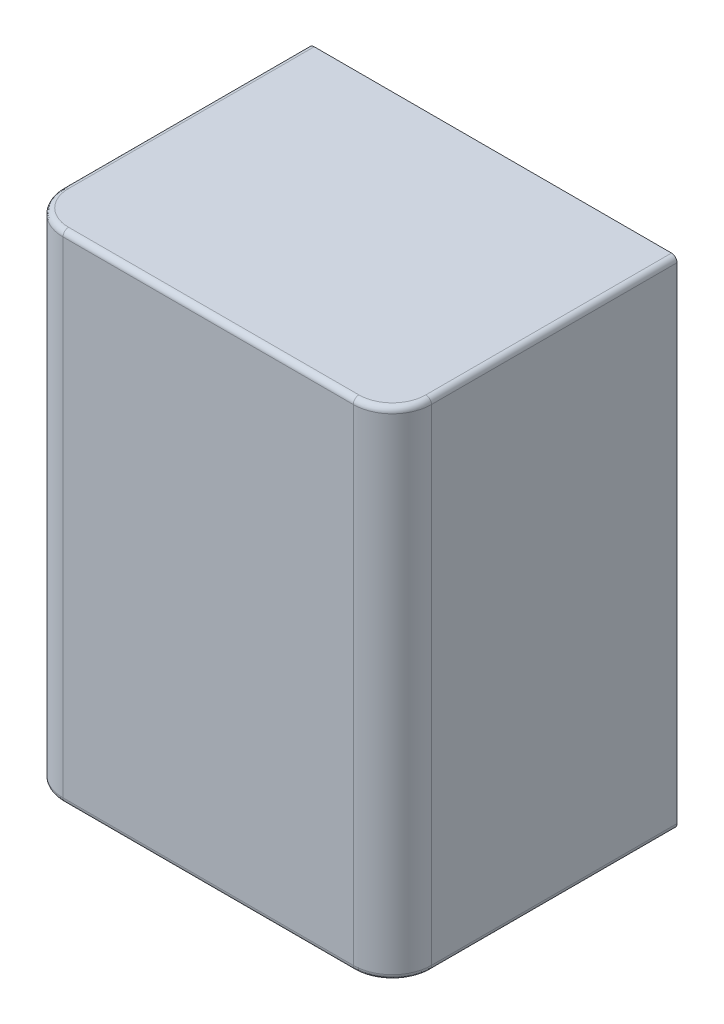
ISO-10303-21;
HEADER;
FILE_DESCRIPTION(('STEP AP214'),'2;1');
FILE_NAME('part.step','',(''),(''),'','','');
FILE_SCHEMA(('AUTOMOTIVE_DESIGN { 1 0 10303 214 1 1 1 1 }'));
ENDSEC;
DATA;
#1=APPLICATION_CONTEXT('core data for automotive mechanical design processes');
#2=APPLICATION_PROTOCOL_DEFINITION('international standard','automotive_design',2000,#1);
#3=PRODUCT_CONTEXT('',#1,'mechanical');
#4=PRODUCT('Part','Part','',(#3));
#5=PRODUCT_RELATED_PRODUCT_CATEGORY('part','',(#4));
#6=PRODUCT_DEFINITION_FORMATION('','',#4);
#7=PRODUCT_DEFINITION_CONTEXT('part definition',#1,'design');
#8=PRODUCT_DEFINITION('design','',#6,#7);
#9=PRODUCT_DEFINITION_SHAPE('','',#8);
#10=(LENGTH_UNIT() NAMED_UNIT(*) SI_UNIT(.MILLI.,.METRE.));
#11=(NAMED_UNIT(*) PLANE_ANGLE_UNIT() SI_UNIT($,.RADIAN.));
#12=(NAMED_UNIT(*) SI_UNIT($,.STERADIAN.) SOLID_ANGLE_UNIT());
#13=UNCERTAINTY_MEASURE_WITH_UNIT(LENGTH_MEASURE(1.E-05),#10,'distance_accuracy_value','');
#14=(GEOMETRIC_REPRESENTATION_CONTEXT(3) GLOBAL_UNCERTAINTY_ASSIGNED_CONTEXT((#13)) GLOBAL_UNIT_ASSIGNED_CONTEXT((#10,
#11,#12)) REPRESENTATION_CONTEXT('',''));
#15=CARTESIAN_POINT('',(0.,0.,0.));
#16=DIRECTION('',(0.,0.,1.));
#17=DIRECTION('',(1.,0.,0.));
#18=AXIS2_PLACEMENT_3D('',#15,#16,#17);
#19=CARTESIAN_POINT('',(55.330001258903,71.945000573336,-1.666522054294));
#20=DIRECTION('',(0.,4.371138828674E-08,-0.999999999999999));
#21=DIRECTION('',(0.,0.999999999999999,4.371138828674E-08));
#22=AXIS2_PLACEMENT_3D('',#19,#20,#21);
#23=PLANE('',#22);
#24=DIRECTION('',(0.999999999999996,-8.74227765734797E-08,0.));
#25=VECTOR('',#24,1.);
#26=CARTESIAN_POINT('',(55.330001181971,71.0650005733364,-1.66652209276));
#27=LINE('',#26,#25);
#28=CARTESIAN_POINT('',(55.2600011819712,71.065000579456,-1.66652209276));
#29=VERTEX_POINT('',#28);
#30=CARTESIAN_POINT('',(54.740001181971,71.0650006249151,-1.66652209276012));
#31=VERTEX_POINT('',#30);
#32=EDGE_CURVE('E140',#29,#31,#27,.F.);
#33=ORIENTED_EDGE('',*,*,#32,.F.);
#34=DIRECTION('',(8.74227765734796E-08,0.999999999999995,4.37113882867398E-08));
#35=VECTOR('',#34,1.);
#36=CARTESIAN_POINT('',(55.2600012589032,71.9450005794552,-1.666522054294));
#37=LINE('',#36,#35);
#38=CARTESIAN_POINT('',(55.260001258029,71.9350005794555,-1.66652205473106));
#39=VERTEX_POINT('',#38);
#40=EDGE_CURVE('E112',#39,#29,#37,.F.);
#41=ORIENTED_EDGE('',*,*,#40,.F.);
#42=DIRECTION('',(-0.999999999999996,8.74227765734797E-08,0.));
#43=VECTOR('',#42,1.);
#44=CARTESIAN_POINT('',(55.330001258029,71.9350005733356,-1.666522054731));
#45=LINE('',#44,#43);
#46=CARTESIAN_POINT('',(54.7400012580289,71.935000624915,-1.66652205473094));
#47=VERTEX_POINT('',#46);
#48=EDGE_CURVE('E108',#47,#39,#45,.F.);
#49=ORIENTED_EDGE('',*,*,#48,.F.);
#50=DIRECTION('',(8.74227765734796E-08,0.999999999999995,4.37113882867398E-08));
#51=VECTOR('',#50,1.);
#52=CARTESIAN_POINT('',(54.740001258903,71.9450006249152,-1.666522054294));
#53=LINE('',#52,#51);
#54=EDGE_CURVE('E110',#31,#47,#53,.T.);
#55=ORIENTED_EDGE('',*,*,#54,.F.);
#56=EDGE_LOOP('',(#33,#41,#49,#55));
#57=FACE_BOUND('',#56,.T.);
#58=ADVANCED_FACE('F17',(#57),#23,.F.);
#59=CARTESIAN_POINT('',(55.330001258029,71.935000576396,-1.736522054731));
#60=CARTESIAN_POINT('',(55.330001258029,71.935000574603,-1.695517004097));
#61=CARTESIAN_POINT('',(55.301006308663,71.935000575871,-1.666522054731));
#62=CARTESIAN_POINT('',(55.260001258029,71.935000579456,-1.666522054731));
#63=CARTESIAN_POINT('',(55.330001258541,71.940858440772,-1.736522054475));
#64=CARTESIAN_POINT('',(55.330001258541,71.940858438979,-1.695517003841));
#65=CARTESIAN_POINT('',(55.301006309175,71.940858440247,-1.666522054475));
#66=CARTESIAN_POINT('',(55.260001258541,71.940858443832,-1.666522054475));
#67=CARTESIAN_POINT('',(55.325859123279,71.945000576758,-1.736522054294));
#68=CARTESIAN_POINT('',(55.325859123279,71.945000575072,-1.697943410531));
#69=CARTESIAN_POINT('',(55.298579902666,71.945000576264,-1.670664189918));
#70=CARTESIAN_POINT('',(55.260001258903,71.945000579637,-1.670664189918));
#71=CARTESIAN_POINT('',(55.320001258903,71.94500057727,-1.736522054294));
#72=CARTESIAN_POINT('',(55.320001258903,71.945000575734,-1.701374868037));
#73=CARTESIAN_POINT('',(55.295148445161,71.94500057682,-1.676522054294));
#74=CARTESIAN_POINT('',(55.260001258903,71.945000579893,-1.676522054294));
#75=(BOUNDED_SURFACE() B_SPLINE_SURFACE(3,3,((#59,#60,#61,#62),(#63,#64,#65,#66),(#67,#68,#69,
#70),(#71,#72,#73,#74)),.UNSPECIFIED.,.F.,.F.,.F.) B_SPLINE_SURFACE_WITH_KNOTS((4,4),(4,4),(0.,
1.),(0.,1.),.UNSPECIFIED.) GEOMETRIC_REPRESENTATION_ITEM() RATIONAL_B_SPLINE_SURFACE(((1.,
0.804737854124,0.804737854124,1.),(0.804737854124,0.647603013861,0.647603013861,0.804737854124),
(0.804737854124,0.647603013861,0.647603013861,0.804737854124),(1.,0.804737854124,0.804737854124,1.))) REPRESENTATION_ITEM('') SURFACE());
#76=CARTESIAN_POINT('',(55.320001258029,71.9350005772702,-1.73652205473111));
#77=DIRECTION('',(0.,-4.371138835999E-08,0.999999999999999));
#78=DIRECTION('',(0.,-0.999999999999999,-4.371138835999E-08));
#79=AXIS2_PLACEMENT_3D('',#76,#77,#78);
#80=CIRCLE('',#79,0.01);
#81=CARTESIAN_POINT('',(55.320001258903,71.9450005772702,-1.736522054294));
#82=VERTEX_POINT('',#81);
#83=CARTESIAN_POINT('',(55.330001258029,71.935000576396,-1.73652208325278));
#84=VERTEX_POINT('',#83);
#85=EDGE_CURVE('E346',#82,#84,#80,.F.);
#86=CARTESIAN_POINT('',(55.320001258903,71.94500057727,-1.736522054294));
#87=CARTESIAN_POINT('',(55.320001258903,71.945000575734,-1.70137486803698));
#88=CARTESIAN_POINT('',(55.295148445161,71.94500057682,-1.67652205429397));
#89=CARTESIAN_POINT('',(55.260001258903,71.945000579893,-1.67652205429397));
#90=(BOUNDED_CURVE() B_SPLINE_CURVE(3,(#86,#87,#88,#89),.UNSPECIFIED.,.F.,
.F.) B_SPLINE_CURVE_WITH_KNOTS((4,4),(0.,1.),
.UNSPECIFIED.) CURVE() GEOMETRIC_REPRESENTATION_ITEM() RATIONAL_B_SPLINE_CURVE((0.999999999998696,
0.804737854122951,0.804737854122951,0.999999999998696)) REPRESENTATION_ITEM(''));
#91=CARTESIAN_POINT('',(55.2600012589031,71.9450005798929,-1.676522054294));
#92=VERTEX_POINT('',#91);
#93=EDGE_CURVE('E302',#92,#82,#90,.F.);
#94=CARTESIAN_POINT('',(55.260001258029,71.9350005798926,-1.676522054731));
#95=DIRECTION('',(-0.999999999999996,8.74227765734797E-08,0.));
#96=DIRECTION('',(-8.74227765734797E-08,-0.999999999999996,0.));
#97=AXIS2_PLACEMENT_3D('',#94,#95,#96);
#98=CIRCLE('',#97,0.01);
#99=EDGE_CURVE('E116',#39,#92,#98,.T.);
#100=CARTESIAN_POINT('',(55.2600012580288,71.9350005825156,-1.73652205473111));
#101=DIRECTION('',(8.74227765734796E-08,0.999999999999995,4.37113882867398E-08));
#102=DIRECTION('',(-0.999999999999996,8.74227765734797E-08,0.));
#103=AXIS2_PLACEMENT_3D('',#100,#101,#102);
#104=CIRCLE('',#103,0.07);
#105=EDGE_CURVE('E201',#84,#39,#104,.F.);
#106=ORIENTED_EDGE('',*,*,#85,.F.);
#107=ORIENTED_EDGE('',*,*,#93,.F.);
#108=ORIENTED_EDGE('',*,*,#99,.F.);
#109=ORIENTED_EDGE('',*,*,#105,.F.);
#110=EDGE_LOOP('',(#106,#107,#108,#109));
#111=FACE_BOUND('',#110,.T.);
#112=ADVANCED_FACE('F178',(#111),#75,.T.);
#113=CARTESIAN_POINT('',(55.330001258029,71.935000573773,-1.676522054731));
#114=DIRECTION('',(-0.999999999999996,8.74227765734797E-08,0.));
#115=DIRECTION('',(-8.74227765734797E-08,-0.999999999999996,0.));
#116=AXIS2_PLACEMENT_3D('',#113,#114,#115);
#117=CYLINDRICAL_SURFACE('',#116,0.01);
#118=ORIENTED_EDGE('',*,*,#48,.T.);
#119=ORIENTED_EDGE('',*,*,#99,.T.);
#120=DIRECTION('',(-0.999999999999996,8.74227765335397E-08,0.));
#121=VECTOR('',#120,1.);
#122=CARTESIAN_POINT('',(55.000001258903,71.9450006026228,-1.676522054294));
#123=LINE('',#122,#121);
#124=CARTESIAN_POINT('',(54.740001258903,71.9450006253527,-1.67652205429397));
#125=VERTEX_POINT('',#124);
#126=EDGE_CURVE('E130',#125,#92,#123,.F.);
#127=ORIENTED_EDGE('',*,*,#126,.F.);
#128=CARTESIAN_POINT('',(54.740001258029,71.935000625352,-1.67652205473103));
#129=DIRECTION('',(-0.999999999999996,8.74038952805653E-08,0.));
#130=DIRECTION('',(1.38777878077792E-12,-4.37025415854775E-08,0.999999999999999));
#131=AXIS2_PLACEMENT_3D('',#128,#129,#130);
#132=CIRCLE('',#131,0.0100000000004965);
#133=EDGE_CURVE('E125',#47,#125,#132,.T.);
#134=ORIENTED_EDGE('',*,*,#133,.F.);
#135=EDGE_LOOP('',(#118,#119,#127,#134));
#136=FACE_BOUND('',#135,.T.);
#137=ADVANCED_FACE('F128',(#136),#117,.T.);
#138=CARTESIAN_POINT('',(54.740001258029,71.935000624915,-1.666522054731));
#139=CARTESIAN_POINT('',(54.698996207395,71.9350006285,-1.666522054731));
#140=CARTESIAN_POINT('',(54.670001258029,71.935000632302,-1.695517004097));
#141=CARTESIAN_POINT('',(54.670001258029,71.935000634095,-1.736522054731));
#142=CARTESIAN_POINT('',(54.740001258541,71.940858489291,-1.666522054475));
#143=CARTESIAN_POINT('',(54.698996207907,71.940858492876,-1.666522054475));
#144=CARTESIAN_POINT('',(54.670001258541,71.940858496678,-1.695517003841));
#145=CARTESIAN_POINT('',(54.670001258541,71.940858498471,-1.736522054475));
#146=CARTESIAN_POINT('',(54.740001258903,71.945000625097,-1.670664189918));
#147=CARTESIAN_POINT('',(54.70142261514,71.945000628469,-1.670664189918));
#148=CARTESIAN_POINT('',(54.674143394527,71.945000632046,-1.697943410531));
#149=CARTESIAN_POINT('',(54.674143394527,71.945000633733,-1.736522054294));
#150=CARTESIAN_POINT('',(54.740001258903,71.945000625353,-1.676522054294));
#151=CARTESIAN_POINT('',(54.704854072645,71.945000628425,-1.676522054294));
#152=CARTESIAN_POINT('',(54.680001258903,71.945000631684,-1.701374868037));
#153=CARTESIAN_POINT('',(54.680001258903,71.945000633221,-1.736522054294));
#154=(BOUNDED_SURFACE() B_SPLINE_SURFACE(3,3,((#138,#139,#140,#141),(#142,#143,#144,#145),(#146,
#147,#148,#149),(#150,#151,#152,#153)),.UNSPECIFIED.,.F.,.F.,
.F.) B_SPLINE_SURFACE_WITH_KNOTS((4,4),(4,4),(0.,1.),(0.,1.),
.UNSPECIFIED.) GEOMETRIC_REPRESENTATION_ITEM() RATIONAL_B_SPLINE_SURFACE(((1.,0.804737854124,
0.804737854124,1.),(0.804737854124,0.647603013861,0.647603013861,0.804737854124),
(0.804737854124,0.647603013861,0.647603013861,0.804737854124),(1.,0.804737854124,0.804737854124,1.))) REPRESENTATION_ITEM('') SURFACE());
#155=CARTESIAN_POINT('',(54.740001258903,71.945000625353,-1.67652205429397));
#156=CARTESIAN_POINT('',(54.704854072645,71.945000628425,-1.67652205429397));
#157=CARTESIAN_POINT('',(54.680001258903,71.945000631684,-1.70137486803698));
#158=CARTESIAN_POINT('',(54.680001258903,71.945000633221,-1.736522054294));
#159=(BOUNDED_CURVE() B_SPLINE_CURVE(3,(#155,#156,#157,#158),.UNSPECIFIED.,.F.,
.F.) B_SPLINE_CURVE_WITH_KNOTS((4,4),(0.,1.),
.UNSPECIFIED.) CURVE() GEOMETRIC_REPRESENTATION_ITEM() RATIONAL_B_SPLINE_CURVE((0.99999999999862,
0.80473785412289,0.80473785412289,0.99999999999862)) REPRESENTATION_ITEM(''));
#160=CARTESIAN_POINT('',(54.680001258903,71.9450006332206,-1.73652205429394));
#161=VERTEX_POINT('',#160);
#162=EDGE_CURVE('E154',#161,#125,#159,.F.);
#163=CARTESIAN_POINT('',(54.680001258029,71.9350006332202,-1.736522054731));
#164=DIRECTION('',(0.,-4.371138835999E-08,0.999999999999999));
#165=DIRECTION('',(0.,-0.999999999999999,-4.371138835999E-08));
#166=AXIS2_PLACEMENT_3D('',#163,#164,#165);
#167=CIRCLE('',#166,0.01);
#168=CARTESIAN_POINT('',(54.6700012580288,71.9350006340949,-1.73652207374553));
#169=VERTEX_POINT('',#168);
#170=EDGE_CURVE('E138',#169,#161,#167,.F.);
#171=CARTESIAN_POINT('',(54.7400012580288,71.9350006279748,-1.73652205473111));
#172=DIRECTION('',(8.74227765734796E-08,0.999999999999995,4.37113882867398E-08));
#173=DIRECTION('',(-0.999999999999996,8.74227765734797E-08,0.));
#174=AXIS2_PLACEMENT_3D('',#171,#172,#173);
#175=CIRCLE('',#174,0.07);
#176=EDGE_CURVE('E122',#47,#169,#175,.F.);
#177=ORIENTED_EDGE('',*,*,#162,.F.);
#178=ORIENTED_EDGE('',*,*,#170,.F.);
#179=ORIENTED_EDGE('',*,*,#176,.F.);
#180=ORIENTED_EDGE('',*,*,#133,.T.);
#181=EDGE_LOOP('',(#177,#178,#179,#180));
#182=FACE_BOUND('',#181,.T.);
#183=ADVANCED_FACE('F136',(#182),#154,.T.);
#184=CARTESIAN_POINT('',(54.740001258903,71.945000627975,-1.736522054294));
#185=DIRECTION('',(8.74227765734796E-08,0.999999999999995,4.37113882867398E-08));
#186=DIRECTION('',(-0.999999999999996,8.74227765734797E-08,0.));
#187=AXIS2_PLACEMENT_3D('',#184,#185,#186);
#188=CYLINDRICAL_SURFACE('',#187,0.07);
#189=ORIENTED_EDGE('',*,*,#176,.T.);
#190=DIRECTION('',(-8.74227765734797E-08,-0.999999999999996,0.));
#191=VECTOR('',#190,1.);
#192=CARTESIAN_POINT('',(54.670001258903,71.945000633221,-1.73652209276));
#193=LINE('',#192,#191);
#194=CARTESIAN_POINT('',(54.670001181971,71.0650006340951,-1.73652209275994));
#195=VERTEX_POINT('',#194);
#196=EDGE_CURVE('E293',#195,#169,#193,.F.);
#197=ORIENTED_EDGE('',*,*,#196,.F.);
#198=CARTESIAN_POINT('',(54.740001181971,71.0650006279754,-1.73652209276001));
#199=DIRECTION('',(-8.74284322442814E-08,-0.999999999999995,-4.37262307754475E-08));
#200=DIRECTION('',(-0.999999999999996,8.7422727787103E-08,1.73472347597679E-13));
#201=AXIS2_PLACEMENT_3D('',#198,#199,#200);
#202=CIRCLE('',#201,0.0700000000000066);
#203=EDGE_CURVE('E124',#31,#195,#202,.T.);
#204=ORIENTED_EDGE('',*,*,#203,.F.);
#205=ORIENTED_EDGE('',*,*,#54,.T.);
#206=EDGE_LOOP('',(#189,#197,#204,#205));
#207=FACE_BOUND('',#206,.T.);
#208=ADVANCED_FACE('F119',(#207),#188,.T.);
#209=CARTESIAN_POINT('',(55.330001181971,71.065000573773,-1.67652209276));
#210=DIRECTION('',(0.999999999999996,-8.74227765734797E-08,0.));
#211=DIRECTION('',(8.74227765734797E-08,0.999999999999996,0.));
#212=AXIS2_PLACEMENT_3D('',#209,#210,#211);
#213=CYLINDRICAL_SURFACE('',#212,0.01);
#214=ORIENTED_EDGE('',*,*,#32,.T.);
#215=CARTESIAN_POINT('',(54.740001181971,71.065000625352,-1.67652209275997));
#216=DIRECTION('',(-0.999999999999996,8.74038952807724E-08,0.));
#217=DIRECTION('',(-1.38777878078496E-12,-4.37025415856992E-08,0.999999999999999));
#218=AXIS2_PLACEMENT_3D('',#215,#216,#217);
#219=CIRCLE('',#218,0.0099999999994997);
#220=CARTESIAN_POINT('',(54.740001181097,71.0550006253527,-1.67652209319703));
#221=VERTEX_POINT('',#220);
#222=EDGE_CURVE('E142',#221,#31,#219,.T.);
#223=ORIENTED_EDGE('',*,*,#222,.F.);
#224=DIRECTION('',(0.999999999999996,-8.74227765639397E-08,0.));
#225=VECTOR('',#224,1.);
#226=CARTESIAN_POINT('',(55.000001181097,71.0550006026228,-1.676522093197));
#227=LINE('',#226,#225);
#228=CARTESIAN_POINT('',(55.260001181097,71.055000579893,-1.676522093197));
#229=VERTEX_POINT('',#228);
#230=EDGE_CURVE('E282',#229,#221,#227,.F.);
#231=ORIENTED_EDGE('',*,*,#230,.F.);
#232=CARTESIAN_POINT('',(55.260001181971,71.065000579893,-1.67652209275997));
#233=DIRECTION('',(0.999999999999996,-8.74027107372815E-08,0.));
#234=DIRECTION('',(-1.38777878078496E-12,-4.37025415856992E-08,0.999999999999999));
#235=AXIS2_PLACEMENT_3D('',#232,#233,#234);
#236=CIRCLE('',#235,0.0099999999999993);
#237=EDGE_CURVE('E353',#29,#229,#236,.T.);
#238=ORIENTED_EDGE('',*,*,#237,.F.);
#239=EDGE_LOOP('',(#214,#223,#231,#238));
#240=FACE_BOUND('',#239,.T.);
#241=ADVANCED_FACE('F382',(#240),#213,.T.);
#242=CARTESIAN_POINT('',(54.670001181971,71.065000634095,-1.73652209276));
#243=CARTESIAN_POINT('',(54.670001181971,71.065000632302,-1.695517042126));
#244=CARTESIAN_POINT('',(54.698996131337,71.0650006285,-1.66652209276));
#245=CARTESIAN_POINT('',(54.740001181971,71.065000624915,-1.66652209276));
#246=CARTESIAN_POINT('',(54.670001181459,71.059142769719,-1.736522093016));
#247=CARTESIAN_POINT('',(54.670001181459,71.059142767926,-1.695517042382));
#248=CARTESIAN_POINT('',(54.698996130825,71.059142764124,-1.666522093016));
#249=CARTESIAN_POINT('',(54.740001181459,71.059142760539,-1.666522093016));
#250=CARTESIAN_POINT('',(54.674143316721,71.055000633733,-1.736522093197));
#251=CARTESIAN_POINT('',(54.674143316721,71.055000632046,-1.697943449435));
#252=CARTESIAN_POINT('',(54.701422537334,71.055000628469,-1.670664228821));
#253=CARTESIAN_POINT('',(54.740001181097,71.055000625097,-1.670664228821));
#254=CARTESIAN_POINT('',(54.680001181097,71.055000633221,-1.736522093197));
#255=CARTESIAN_POINT('',(54.680001181097,71.055000631684,-1.70137490694));
#256=CARTESIAN_POINT('',(54.704853994839,71.055000628425,-1.676522093197));
#257=CARTESIAN_POINT('',(54.740001181097,71.055000625353,-1.676522093197));
#258=(BOUNDED_SURFACE() B_SPLINE_SURFACE(3,3,((#242,#243,#244,#245),(#246,#247,#248,#249),(#250,
#251,#252,#253),(#254,#255,#256,#257)),.UNSPECIFIED.,.F.,.F.,
.F.) B_SPLINE_SURFACE_WITH_KNOTS((4,4),(4,4),(0.,1.),(0.,1.),
.UNSPECIFIED.) GEOMETRIC_REPRESENTATION_ITEM() RATIONAL_B_SPLINE_SURFACE(((1.,0.804737854124,
0.804737854124,1.),(0.804737854124,0.647603013861,0.647603013861,0.804737854124),
(0.804737854124,0.647603013861,0.647603013861,0.804737854124),(1.,0.804737854124,0.804737854124,1.))) REPRESENTATION_ITEM('') SURFACE());
#259=CARTESIAN_POINT('',(54.680001181971,71.0650006332202,-1.73652209275989));
#260=DIRECTION('',(0.,4.371138821348E-08,-0.999999999999999));
#261=DIRECTION('',(0.,0.999999999999999,4.371138821348E-08));
#262=AXIS2_PLACEMENT_3D('',#259,#260,#261);
#263=CIRCLE('',#262,0.01);
#264=CARTESIAN_POINT('',(54.680001181097,71.0550006332207,-1.736522093197));
#265=VERTEX_POINT('',#264);
#266=EDGE_CURVE('E288',#265,#195,#263,.T.);
#267=CARTESIAN_POINT('',(54.680001181097,71.055000633221,-1.736522093197));
#268=CARTESIAN_POINT('',(54.680001181097,71.055000631684,-1.70137490693998));
#269=CARTESIAN_POINT('',(54.704853994839,71.055000628425,-1.67652209319697));
#270=CARTESIAN_POINT('',(54.740001181097,71.055000625353,-1.67652209319697));
#271=(BOUNDED_CURVE() B_SPLINE_CURVE(3,(#267,#268,#269,#270),.UNSPECIFIED.,.F.,
.F.) B_SPLINE_CURVE_WITH_KNOTS((4,4),(0.,1.),
.UNSPECIFIED.) CURVE() GEOMETRIC_REPRESENTATION_ITEM() RATIONAL_B_SPLINE_CURVE((0.999999999998653,
0.804737854122916,0.804737854122916,0.999999999998653)) REPRESENTATION_ITEM(''));
#272=EDGE_CURVE('E279',#221,#265,#271,.F.);
#273=ORIENTED_EDGE('',*,*,#222,.T.);
#274=ORIENTED_EDGE('',*,*,#203,.T.);
#275=ORIENTED_EDGE('',*,*,#266,.F.);
#276=ORIENTED_EDGE('',*,*,#272,.F.);
#277=EDGE_LOOP('',(#273,#274,#275,#276));
#278=FACE_BOUND('',#277,.T.);
#279=ADVANCED_FACE('F370',(#278),#258,.T.);
#280=CARTESIAN_POINT('',(55.260001181971,71.065000579456,-1.66652209276));
#281=CARTESIAN_POINT('',(55.301006232605,71.065000575871,-1.66652209276));
#282=CARTESIAN_POINT('',(55.330001181971,71.065000574603,-1.695517042126));
#283=CARTESIAN_POINT('',(55.330001181971,71.065000576396,-1.73652209276));
#284=CARTESIAN_POINT('',(55.260001181459,71.05914271508,-1.666522093016));
#285=CARTESIAN_POINT('',(55.301006232093,71.059142711495,-1.666522093016));
#286=CARTESIAN_POINT('',(55.330001181459,71.059142710227,-1.695517042382));
#287=CARTESIAN_POINT('',(55.330001181459,71.05914271202,-1.736522093016));
#288=CARTESIAN_POINT('',(55.260001181097,71.055000579637,-1.670664228821));
#289=CARTESIAN_POINT('',(55.29857982486,71.055000576264,-1.670664228821));
#290=CARTESIAN_POINT('',(55.325859045473,71.055000575072,-1.697943449435));
#291=CARTESIAN_POINT('',(55.325859045473,71.055000576758,-1.736522093197));
#292=CARTESIAN_POINT('',(55.260001181097,71.055000579893,-1.676522093197));
#293=CARTESIAN_POINT('',(55.295148367355,71.05500057682,-1.676522093197));
#294=CARTESIAN_POINT('',(55.320001181097,71.055000575734,-1.70137490694));
#295=CARTESIAN_POINT('',(55.320001181097,71.05500057727,-1.736522093197));
#296=(BOUNDED_SURFACE() B_SPLINE_SURFACE(3,3,((#280,#281,#282,#283),(#284,#285,#286,#287),(#288,
#289,#290,#291),(#292,#293,#294,#295)),.UNSPECIFIED.,.F.,.F.,
.F.) B_SPLINE_SURFACE_WITH_KNOTS((4,4),(4,4),(0.,1.),(0.,1.),
.UNSPECIFIED.) GEOMETRIC_REPRESENTATION_ITEM() RATIONAL_B_SPLINE_SURFACE(((1.,0.804737854124,
0.804737854124,1.),(0.804737854124,0.647603013861,0.647603013861,0.804737854124),
(0.804737854124,0.647603013861,0.647603013861,0.804737854124),(1.,0.804737854124,0.804737854124,1.))) REPRESENTATION_ITEM('') SURFACE());
#297=CARTESIAN_POINT('',(55.260001181097,71.055000579893,-1.67652209319696));
#298=CARTESIAN_POINT('',(55.295148367355,71.05500057682,-1.67652209319696));
#299=CARTESIAN_POINT('',(55.320001181097,71.055000575734,-1.70137490693998));
#300=CARTESIAN_POINT('',(55.320001181097,71.05500057727,-1.736522093197));
#301=(BOUNDED_CURVE() B_SPLINE_CURVE(3,(#297,#298,#299,#300),.UNSPECIFIED.,.F.,
.F.) B_SPLINE_CURVE_WITH_KNOTS((4,4),(0.,1.),
.UNSPECIFIED.) CURVE() GEOMETRIC_REPRESENTATION_ITEM() RATIONAL_B_SPLINE_CURVE((0.999999999998503,
0.804737854122796,0.804737854122796,0.999999999998503)) REPRESENTATION_ITEM(''));
#302=CARTESIAN_POINT('',(55.320001181097,71.0550005772701,-1.73652209319706));
#303=VERTEX_POINT('',#302);
#304=EDGE_CURVE('E246',#303,#229,#301,.F.);
#305=CARTESIAN_POINT('',(55.320001181971,71.0650005772702,-1.73652209276));
#306=DIRECTION('',(0.,4.371138821348E-08,-0.999999999999999));
#307=DIRECTION('',(0.,0.999999999999999,4.371138821348E-08));
#308=AXIS2_PLACEMENT_3D('',#305,#306,#307);
#309=CIRCLE('',#308,0.01);
#310=CARTESIAN_POINT('',(55.3300011819711,71.0650005908208,-1.73652209276));
#311=VERTEX_POINT('',#310);
#312=EDGE_CURVE('E238',#311,#303,#309,.T.);
#313=CARTESIAN_POINT('',(55.260001181971,71.0650005825158,-1.73652209276002));
#314=DIRECTION('',(8.74227765734796E-08,0.999999999999995,4.37113882867398E-08));
#315=DIRECTION('',(-0.999999999999996,8.74227765734797E-08,0.));
#316=AXIS2_PLACEMENT_3D('',#313,#314,#315);
#317=CIRCLE('',#316,0.07);
#318=EDGE_CURVE('E66',#29,#311,#317,.T.);
#319=ORIENTED_EDGE('',*,*,#304,.F.);
#320=ORIENTED_EDGE('',*,*,#312,.F.);
#321=ORIENTED_EDGE('',*,*,#318,.F.);
#322=ORIENTED_EDGE('',*,*,#237,.T.);
#323=EDGE_LOOP('',(#319,#320,#321,#322));
#324=FACE_BOUND('',#323,.T.);
#325=ADVANCED_FACE('F381',(#324),#296,.T.);
#326=CARTESIAN_POINT('',(55.260001258903,71.945000582515,-1.736522054294));
#327=DIRECTION('',(8.74227765734796E-08,0.999999999999995,4.37113882867398E-08));
#328=DIRECTION('',(-0.999999999999996,8.74227765734797E-08,0.));
#329=AXIS2_PLACEMENT_3D('',#326,#327,#328);
#330=CYLINDRICAL_SURFACE('',#329,0.07);
#331=ORIENTED_EDGE('',*,*,#318,.T.);
#332=DIRECTION('',(-8.74227765734797E-08,-0.999999999999996,0.));
#333=VECTOR('',#332,1.);
#334=CARTESIAN_POINT('',(55.330001181097,71.055000610054,-1.73652209276));
#335=LINE('',#334,#333);
#336=EDGE_CURVE('E226',#311,#84,#335,.F.);
#337=ORIENTED_EDGE('',*,*,#336,.T.);
#338=ORIENTED_EDGE('',*,*,#105,.T.);
#339=ORIENTED_EDGE('',*,*,#40,.T.);
#340=EDGE_LOOP('',(#331,#337,#338,#339));
#341=FACE_BOUND('',#340,.T.);
#342=ADVANCED_FACE('F435',(#341),#330,.T.);
#343=CARTESIAN_POINT('',(55.320001258029,71.935000610928,-2.506522054731));
#344=DIRECTION('',(0.,-4.371138835999E-08,0.999999999999999));
#345=DIRECTION('',(0.,-0.999999999999999,-4.371138835999E-08));
#346=AXIS2_PLACEMENT_3D('',#343,#344,#345);
#347=CYLINDRICAL_SURFACE('',#346,0.01);
#348=DIRECTION('',(0.,0.,1.));
#349=VECTOR('',#348,1.);
#350=CARTESIAN_POINT('',(55.330001258029,71.935000576396,-2.506522093197));
#351=LINE('',#350,#349);
#352=CARTESIAN_POINT('',(55.33000122,71.9350005960661,-2.176522054731));
#353=VERTEX_POINT('',#352);
#354=EDGE_CURVE('E230',#84,#353,#351,.F.);
#355=ORIENTED_EDGE('',*,*,#354,.T.);
#356=CARTESIAN_POINT('',(55.320001258029,71.9350005965032,-2.176522054731));
#357=DIRECTION('',(0.,-4.371138835999E-08,0.999999999999999));
#358=DIRECTION('',(0.,-0.999999999999999,-4.371138835999E-08));
#359=AXIS2_PLACEMENT_3D('',#356,#357,#358);
#360=CIRCLE('',#359,0.01);
#361=CARTESIAN_POINT('',(55.320001258466,71.945000596503,-2.17652205429416));
#362=VERTEX_POINT('',#361);
#363=EDGE_CURVE('E20',#353,#362,#360,.T.);
#364=ORIENTED_EDGE('',*,*,#363,.T.);
#365=DIRECTION('',(0.,-4.37113883711696E-08,0.999999999999999));
#366=VECTOR('',#365,1.);
#367=CARTESIAN_POINT('',(55.320001258903,71.9450005857217,-1.929869658031));
#368=LINE('',#367,#366);
#369=EDGE_CURVE('E334',#82,#362,#368,.F.);
#370=ORIENTED_EDGE('',*,*,#369,.F.);
#371=ORIENTED_EDGE('',*,*,#85,.T.);
#372=EDGE_LOOP('',(#355,#364,#370,#371));
#373=FACE_BOUND('',#372,.T.);
#374=ADVANCED_FACE('F320',(#373),#347,.T.);
#375=CARTESIAN_POINT('',(55.000001258903,71.945000613697,-1.929869658031));
#376=DIRECTION('',(8.74227765335396E-08,0.999999999999995,4.37113883711698E-08));
#377=DIRECTION('',(-0.999999999999996,8.74227765335397E-08,0.));
#378=AXIS2_PLACEMENT_3D('',#375,#376,#377);
#379=PLANE('',#378);
#380=ORIENTED_EDGE('',*,*,#162,.T.);
#381=ORIENTED_EDGE('',*,*,#126,.T.);
#382=ORIENTED_EDGE('',*,*,#93,.T.);
#383=ORIENTED_EDGE('',*,*,#369,.T.);
#384=DIRECTION('',(1.,0.,0.));
#385=VECTOR('',#384,1.);
#386=CARTESIAN_POINT('',(55.00000122,71.945000596503,-2.17652205429443));
#387=LINE('',#386,#385);
#388=CARTESIAN_POINT('',(54.680001258466,71.9450006244781,-2.176522054294));
#389=VERTEX_POINT('',#388);
#390=EDGE_CURVE('E218',#362,#389,#387,.F.);
#391=ORIENTED_EDGE('',*,*,#390,.T.);
#392=DIRECTION('',(0.,-4.371138835999E-08,0.999999999999999));
#393=VECTOR('',#392,1.);
#394=CARTESIAN_POINT('',(54.680001258903,71.945000632346,-1.71652205429389));
#395=LINE('',#394,#393);
#396=EDGE_CURVE('E296',#161,#389,#395,.F.);
#397=ORIENTED_EDGE('',*,*,#396,.F.);
#398=EDGE_LOOP('',(#380,#381,#382,#383,#391,#397));
#399=FACE_BOUND('',#398,.T.);
#400=ADVANCED_FACE('F309',(#399),#379,.T.);
#401=CARTESIAN_POINT('',(54.680001258029,71.935000632346,-1.716522054731));
#402=DIRECTION('',(0.,-4.371138835999E-08,0.999999999999999));
#403=DIRECTION('',(0.,-0.999999999999999,-4.371138835999E-08));
#404=AXIS2_PLACEMENT_3D('',#401,#402,#403);
#405=CYLINDRICAL_SURFACE('',#404,0.01);
#406=ORIENTED_EDGE('',*,*,#396,.T.);
#407=CARTESIAN_POINT('',(54.680001258029,71.9350006524532,-2.17652205473111));
#408=DIRECTION('',(0.,-4.371138835999E-08,0.999999999999999));
#409=DIRECTION('',(0.,-0.999999999999999,-4.371138835999E-08));
#410=AXIS2_PLACEMENT_3D('',#407,#408,#409);
#411=CIRCLE('',#410,0.01);
#412=CARTESIAN_POINT('',(54.6700012580289,71.9350006432741,-2.17652205473133));
#413=VERTEX_POINT('',#412);
#414=EDGE_CURVE('E216',#389,#413,#411,.T.);
#415=ORIENTED_EDGE('',*,*,#414,.T.);
#416=DIRECTION('',(0.,0.,1.));
#417=VECTOR('',#416,1.);
#418=CARTESIAN_POINT('',(54.6700012580288,71.935000634095,-1.716522054294));
#419=LINE('',#418,#417);
#420=EDGE_CURVE('E291',#169,#413,#419,.F.);
#421=ORIENTED_EDGE('',*,*,#420,.F.);
#422=ORIENTED_EDGE('',*,*,#170,.T.);
#423=EDGE_LOOP('',(#406,#415,#421,#422));
#424=FACE_BOUND('',#423,.T.);
#425=ADVANCED_FACE('F319',(#424),#405,.T.);
#426=CARTESIAN_POINT('',(54.670001258903,71.945000633221,-1.716522054294));
#427=DIRECTION('',(-0.999999999999996,8.74227765734797E-08,0.));
#428=DIRECTION('',(-8.74227765734797E-08,-0.999999999999996,0.));
#429=AXIS2_PLACEMENT_3D('',#426,#427,#428);
#430=PLANE('',#429);
#431=ORIENTED_EDGE('',*,*,#420,.T.);
#432=DIRECTION('',(0.,-0.999999999999999,-4.371138850878E-08));
#433=VECTOR('',#432,1.);
#434=CARTESIAN_POINT('',(54.670001258029,71.500000624478,-2.176522073746));
#435=LINE('',#434,#433);
#436=CARTESIAN_POINT('',(54.67000122,71.0650006528906,-2.17652209276));
#437=VERTEX_POINT('',#436);
#438=EDGE_CURVE('E215',#413,#437,#435,.T.);
#439=ORIENTED_EDGE('',*,*,#438,.T.);
#440=DIRECTION('',(0.,4.371138821348E-08,-0.999999999999999));
#441=VECTOR('',#440,1.);
#442=CARTESIAN_POINT('',(54.670001181971,71.0650006332208,-1.71652209276));
#443=LINE('',#442,#441);
#444=EDGE_CURVE('E286',#195,#437,#443,.T.);
#445=ORIENTED_EDGE('',*,*,#444,.F.);
#446=ORIENTED_EDGE('',*,*,#196,.T.);
#447=EDGE_LOOP('',(#431,#439,#445,#446));
#448=FACE_BOUND('',#447,.T.);
#449=ADVANCED_FACE('F444',(#448),#430,.T.);
#450=CARTESIAN_POINT('',(54.680001181971,71.065000632346,-1.71652209276));
#451=DIRECTION('',(0.,4.371138821348E-08,-0.999999999999999));
#452=DIRECTION('',(0.,0.999999999999999,4.371138821348E-08));
#453=AXIS2_PLACEMENT_3D('',#450,#451,#452);
#454=CYLINDRICAL_SURFACE('',#453,0.01);
#455=ORIENTED_EDGE('',*,*,#444,.T.);
#456=CARTESIAN_POINT('',(54.680001181971,71.0650006524532,-2.17652209276));
#457=DIRECTION('',(0.,4.371138821348E-08,-0.999999999999999));
#458=DIRECTION('',(0.,0.999999999999999,4.371138821348E-08));
#459=AXIS2_PLACEMENT_3D('',#456,#457,#458);
#460=CIRCLE('',#459,0.01);
#461=CARTESIAN_POINT('',(54.680001181534,71.055000652454,-2.17652209319734));
#462=VERTEX_POINT('',#461);
#463=EDGE_CURVE('E213',#437,#462,#460,.F.);
#464=ORIENTED_EDGE('',*,*,#463,.T.);
#465=DIRECTION('',(0.,-4.37113882277196E-08,0.999999999999999));
#466=VECTOR('',#465,1.);
#467=CARTESIAN_POINT('',(54.680001181097,71.0550006416723,-1.929869696934));
#468=LINE('',#467,#466);
#469=EDGE_CURVE('E272',#265,#462,#468,.F.);
#470=ORIENTED_EDGE('',*,*,#469,.F.);
#471=ORIENTED_EDGE('',*,*,#266,.T.);
#472=EDGE_LOOP('',(#455,#464,#470,#471));
#473=FACE_BOUND('',#472,.T.);
#474=ADVANCED_FACE('F265',(#473),#454,.T.);
#475=CARTESIAN_POINT('',(55.000001181097,71.055000613697,-1.929869696934));
#476=DIRECTION('',(-8.74227765639396E-08,-0.999999999999995,-4.37113882277198E-08));
#477=DIRECTION('',(0.999999999999996,-8.74227765639397E-08,0.));
#478=AXIS2_PLACEMENT_3D('',#475,#476,#477);
#479=PLANE('',#478);
#480=ORIENTED_EDGE('',*,*,#272,.T.);
#481=ORIENTED_EDGE('',*,*,#469,.T.);
#482=DIRECTION('',(1.,0.,0.));
#483=VECTOR('',#482,1.);
#484=CARTESIAN_POINT('',(55.00000122,71.055000652454,-2.17652209319757));
#485=LINE('',#484,#483);
#486=CARTESIAN_POINT('',(55.320001181534,71.0550006244786,-2.176522093197));
#487=VERTEX_POINT('',#486);
#488=EDGE_CURVE('E212',#462,#487,#485,.T.);
#489=ORIENTED_EDGE('',*,*,#488,.T.);
#490=DIRECTION('',(0.,4.371138821348E-08,-0.999999999999999));
#491=VECTOR('',#490,1.);
#492=CARTESIAN_POINT('',(55.320001181097,71.055000610928,-2.50652209319711));
#493=LINE('',#492,#491);
#494=EDGE_CURVE('E234',#303,#487,#493,.T.);
#495=ORIENTED_EDGE('',*,*,#494,.F.);
#496=ORIENTED_EDGE('',*,*,#304,.T.);
#497=ORIENTED_EDGE('',*,*,#230,.T.);
#498=EDGE_LOOP('',(#480,#481,#489,#495,#496,#497));
#499=FACE_BOUND('',#498,.T.);
#500=ADVANCED_FACE('F254',(#499),#479,.T.);
#501=CARTESIAN_POINT('',(55.320001181971,71.065000610928,-2.50652209276));
#502=DIRECTION('',(0.,4.371138821348E-08,-0.999999999999999));
#503=DIRECTION('',(0.,0.999999999999999,4.371138821348E-08));
#504=AXIS2_PLACEMENT_3D('',#501,#502,#503);
#505=CYLINDRICAL_SURFACE('',#504,0.01);
#506=ORIENTED_EDGE('',*,*,#494,.T.);
#507=CARTESIAN_POINT('',(55.320001181971,71.0650005965032,-2.17652209275989));
#508=DIRECTION('',(0.,4.371138821348E-08,-0.999999999999999));
#509=DIRECTION('',(0.,0.999999999999999,4.371138821348E-08));
#510=AXIS2_PLACEMENT_3D('',#507,#508,#509);
#511=CIRCLE('',#510,0.01);
#512=CARTESIAN_POINT('',(55.3300011819711,71.0650005960661,-2.17652209276017));
#513=VERTEX_POINT('',#512);
#514=EDGE_CURVE('E26',#487,#513,#511,.F.);
#515=ORIENTED_EDGE('',*,*,#514,.T.);
#516=DIRECTION('',(0.,0.,1.));
#517=VECTOR('',#516,1.);
#518=CARTESIAN_POINT('',(55.3300011819712,71.065000595629,-2.506522093197));
#519=LINE('',#518,#517);
#520=EDGE_CURVE('E34',#513,#311,#519,.T.);
#521=ORIENTED_EDGE('',*,*,#520,.T.);
#522=ORIENTED_EDGE('',*,*,#312,.T.);
#523=EDGE_LOOP('',(#506,#515,#521,#522));
#524=FACE_BOUND('',#523,.T.);
#525=ADVANCED_FACE('F264',(#524),#505,.T.);
#526=CARTESIAN_POINT('',(55.330001181097,71.055000610054,-2.506522093197));
#527=DIRECTION('',(-0.999999999999996,8.74227765734797E-08,0.));
#528=DIRECTION('',(-8.74227765734797E-08,-0.999999999999996,0.));
#529=AXIS2_PLACEMENT_3D('',#526,#527,#528);
#530=PLANE('',#529);
#531=ORIENTED_EDGE('',*,*,#520,.F.);
#532=DIRECTION('',(0.,-0.999999999999999,-4.371138850878E-08));
#533=VECTOR('',#532,1.);
#534=CARTESIAN_POINT('',(55.330001181971,71.500000624478,-2.176522073746));
#535=LINE('',#534,#533);
#536=EDGE_CURVE('E11',#513,#353,#535,.F.);
#537=ORIENTED_EDGE('',*,*,#536,.T.);
#538=ORIENTED_EDGE('',*,*,#354,.F.);
#539=ORIENTED_EDGE('',*,*,#336,.F.);
#540=EDGE_LOOP('',(#531,#537,#538,#539));
#541=FACE_BOUND('',#540,.T.);
#542=ADVANCED_FACE('F399',(#541),#530,.F.);
#543=CARTESIAN_POINT('',(55.00000122,71.500000624478,-2.176522073746));
#544=DIRECTION('',(0.,-4.371138850878E-08,0.999999999999999));
#545=DIRECTION('',(0.,-0.999999999999999,-4.371138850878E-08));
#546=AXIS2_PLACEMENT_3D('',#543,#544,#545);
#547=PLANE('',#546);
#548=ORIENTED_EDGE('',*,*,#514,.F.);
#549=ORIENTED_EDGE('',*,*,#488,.F.);
#550=ORIENTED_EDGE('',*,*,#463,.F.);
#551=ORIENTED_EDGE('',*,*,#438,.F.);
#552=ORIENTED_EDGE('',*,*,#414,.F.);
#553=ORIENTED_EDGE('',*,*,#390,.F.);
#554=ORIENTED_EDGE('',*,*,#363,.F.);
#555=ORIENTED_EDGE('',*,*,#536,.F.);
#556=EDGE_LOOP('',(#548,#549,#550,#551,#552,#553,#554,#555));
#557=FACE_BOUND('',#556,.T.);
#558=ADVANCED_FACE('F397',(#557),#547,.F.);
#559=CLOSED_SHELL('',(#58,#112,#137,#183,#208,#241,#279,#325,#342,#374,#400,#425,#449,#474,#500,
#525,#542,#558));
#560=MANIFOLD_SOLID_BREP('B1',#559);
#561=ADVANCED_BREP_SHAPE_REPRESENTATION('',(#18,#560),#14);
#562=SHAPE_DEFINITION_REPRESENTATION(#9,#561);
ENDSEC;
END-ISO-10303-21;
